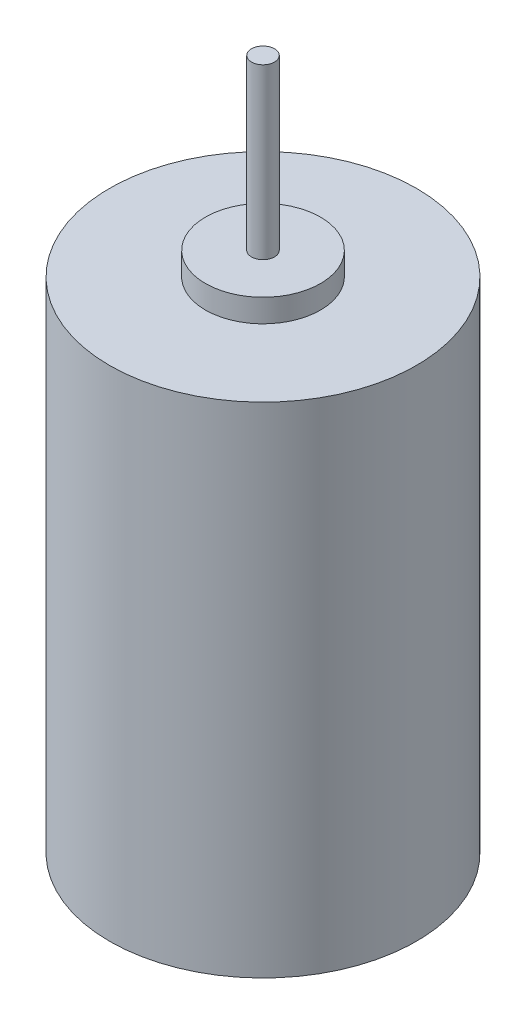
ISO-10303-21;
HEADER;
FILE_DESCRIPTION(('STEP AP214'),'2;1');
FILE_NAME('part.step','',(''),(''),'','','');
FILE_SCHEMA(('AUTOMOTIVE_DESIGN { 1 0 10303 214 1 1 1 1 }'));
ENDSEC;
DATA;
#1=APPLICATION_CONTEXT('core data for automotive mechanical design processes');
#2=APPLICATION_PROTOCOL_DEFINITION('international standard','automotive_design',2000,#1);
#3=PRODUCT_CONTEXT('',#1,'mechanical');
#4=PRODUCT('Part','Part','',(#3));
#5=PRODUCT_RELATED_PRODUCT_CATEGORY('part','',(#4));
#6=PRODUCT_DEFINITION_FORMATION('','',#4);
#7=PRODUCT_DEFINITION_CONTEXT('part definition',#1,'design');
#8=PRODUCT_DEFINITION('design','',#6,#7);
#9=PRODUCT_DEFINITION_SHAPE('','',#8);
#10=(LENGTH_UNIT() NAMED_UNIT(*) SI_UNIT(.MILLI.,.METRE.));
#11=(NAMED_UNIT(*) PLANE_ANGLE_UNIT() SI_UNIT($,.RADIAN.));
#12=(NAMED_UNIT(*) SI_UNIT($,.STERADIAN.) SOLID_ANGLE_UNIT());
#13=UNCERTAINTY_MEASURE_WITH_UNIT(LENGTH_MEASURE(1.E-05),#10,'distance_accuracy_value','');
#14=(GEOMETRIC_REPRESENTATION_CONTEXT(3) GLOBAL_UNCERTAINTY_ASSIGNED_CONTEXT((#13)) GLOBAL_UNIT_ASSIGNED_CONTEXT((#10,
#11,#12)) REPRESENTATION_CONTEXT('',''));
#15=CARTESIAN_POINT('',(0.,0.,0.));
#16=DIRECTION('',(0.,0.,1.));
#17=DIRECTION('',(1.,0.,0.));
#18=AXIS2_PLACEMENT_3D('',#15,#16,#17);
#19=CARTESIAN_POINT('',(0.,65.,0.));
#20=DIRECTION('',(0.,-1.,0.));
#21=DIRECTION('',(0.,0.,-1.));
#22=AXIS2_PLACEMENT_3D('',#19,#20,#21);
#23=CYLINDRICAL_SURFACE('',#22,20.);
#24=CARTESIAN_POINT('',(0.,65.,0.));
#25=DIRECTION('',(0.,1.,0.));
#26=DIRECTION('',(0.,0.,1.));
#27=AXIS2_PLACEMENT_3D('',#24,#25,#26);
#28=CIRCLE('',#27,20.);
#29=CARTESIAN_POINT('',(0.,65.,20.));
#30=VERTEX_POINT('',#29);
#31=EDGE_CURVE('E43',#30,#30,#28,.T.);
#32=ORIENTED_EDGE('',*,*,#31,.F.);
#33=EDGE_LOOP('',(#32));
#34=FACE_BOUND('',#33,.T.);
#35=CARTESIAN_POINT('',(0.,0.,0.));
#36=DIRECTION('',(0.,1.,0.));
#37=DIRECTION('',(0.,0.,1.));
#38=AXIS2_PLACEMENT_3D('',#35,#36,#37);
#39=CIRCLE('',#38,20.);
#40=CARTESIAN_POINT('',(0.,0.,20.));
#41=VERTEX_POINT('',#40);
#42=EDGE_CURVE('E48',#41,#41,#39,.T.);
#43=ORIENTED_EDGE('',*,*,#42,.T.);
#44=EDGE_LOOP('',(#43));
#45=FACE_BOUND('',#44,.T.);
#46=ADVANCED_FACE('F33',(#34,#45),#23,.T.);
#47=CARTESIAN_POINT('',(0.,65.,0.));
#48=DIRECTION('',(0.,1.,0.));
#49=DIRECTION('',(0.,0.,1.));
#50=AXIS2_PLACEMENT_3D('',#47,#48,#49);
#51=PLANE('',#50);
#52=CARTESIAN_POINT('',(0.,65.,0.));
#53=DIRECTION('',(0.,1.,0.));
#54=DIRECTION('',(0.,0.,1.));
#55=AXIS2_PLACEMENT_3D('',#52,#53,#54);
#56=CIRCLE('',#55,7.5);
#57=CARTESIAN_POINT('',(0.,65.,7.5));
#58=VERTEX_POINT('',#57);
#59=EDGE_CURVE('E39',#58,#58,#56,.T.);
#60=ORIENTED_EDGE('',*,*,#59,.F.);
#61=EDGE_LOOP('',(#60));
#62=FACE_BOUND('',#61,.T.);
#63=ORIENTED_EDGE('',*,*,#31,.T.);
#64=EDGE_LOOP('',(#63));
#65=FACE_BOUND('',#64,.T.);
#66=ADVANCED_FACE('F94',(#62,#65),#51,.T.);
#67=CARTESIAN_POINT('',(0.,0.,0.));
#68=DIRECTION('',(0.,1.,0.));
#69=DIRECTION('',(0.,0.,1.));
#70=AXIS2_PLACEMENT_3D('',#67,#68,#69);
#71=PLANE('',#70);
#72=CARTESIAN_POINT('',(0.,0.,0.));
#73=DIRECTION('',(0.,1.,0.));
#74=DIRECTION('',(0.,0.,1.));
#75=AXIS2_PLACEMENT_3D('',#72,#73,#74);
#76=CIRCLE('',#75,7.5);
#77=CARTESIAN_POINT('',(0.,0.,7.5));
#78=VERTEX_POINT('',#77);
#79=EDGE_CURVE('E55',#78,#78,#76,.T.);
#80=ORIENTED_EDGE('',*,*,#79,.T.);
#81=EDGE_LOOP('',(#80));
#82=FACE_BOUND('',#81,.T.);
#83=ORIENTED_EDGE('',*,*,#42,.F.);
#84=EDGE_LOOP('',(#83));
#85=FACE_BOUND('',#84,.T.);
#86=ADVANCED_FACE('F99',(#82,#85),#71,.F.);
#87=CARTESIAN_POINT('',(0.,-3.,0.));
#88=DIRECTION('',(0.,1.,0.));
#89=DIRECTION('',(0.,0.,1.));
#90=AXIS2_PLACEMENT_3D('',#87,#88,#89);
#91=PLANE('',#90);
#92=CARTESIAN_POINT('',(0.,-3.,0.));
#93=DIRECTION('',(0.,1.,0.));
#94=DIRECTION('',(0.,0.,1.));
#95=AXIS2_PLACEMENT_3D('',#92,#93,#94);
#96=CIRCLE('',#95,1.5);
#97=CARTESIAN_POINT('',(0.,-3.,1.5));
#98=VERTEX_POINT('',#97);
#99=EDGE_CURVE('E64',#98,#98,#96,.T.);
#100=ORIENTED_EDGE('',*,*,#99,.T.);
#101=EDGE_LOOP('',(#100));
#102=FACE_BOUND('',#101,.T.);
#103=CARTESIAN_POINT('',(0.,-3.,0.));
#104=DIRECTION('',(0.,1.,0.));
#105=DIRECTION('',(0.,0.,1.));
#106=AXIS2_PLACEMENT_3D('',#103,#104,#105);
#107=CIRCLE('',#106,7.5);
#108=CARTESIAN_POINT('',(0.,-3.,7.5));
#109=VERTEX_POINT('',#108);
#110=EDGE_CURVE('E51',#109,#109,#107,.T.);
#111=ORIENTED_EDGE('',*,*,#110,.F.);
#112=EDGE_LOOP('',(#111));
#113=FACE_BOUND('',#112,.T.);
#114=ADVANCED_FACE('F107',(#102,#113),#91,.F.);
#115=CARTESIAN_POINT('',(0.,-3.,0.));
#116=DIRECTION('',(0.,1.,0.));
#117=DIRECTION('',(0.,0.,1.));
#118=AXIS2_PLACEMENT_3D('',#115,#116,#117);
#119=CYLINDRICAL_SURFACE('',#118,7.5);
#120=ORIENTED_EDGE('',*,*,#110,.T.);
#121=EDGE_LOOP('',(#120));
#122=FACE_BOUND('',#121,.T.);
#123=ORIENTED_EDGE('',*,*,#79,.F.);
#124=EDGE_LOOP('',(#123));
#125=FACE_BOUND('',#124,.T.);
#126=ADVANCED_FACE('F111',(#122,#125),#119,.T.);
#127=ORIENTED_EDGE('',*,*,#59,.T.);
#128=EDGE_LOOP('',(#127));
#129=FACE_BOUND('',#128,.T.);
#130=CARTESIAN_POINT('',(0.,68.,0.));
#131=DIRECTION('',(0.,1.,0.));
#132=DIRECTION('',(0.,0.,1.));
#133=AXIS2_PLACEMENT_3D('',#130,#131,#132);
#134=CIRCLE('',#133,7.5);
#135=CARTESIAN_POINT('',(0.,68.,7.5));
#136=VERTEX_POINT('',#135);
#137=EDGE_CURVE('E60',#136,#136,#134,.T.);
#138=ORIENTED_EDGE('',*,*,#137,.F.);
#139=EDGE_LOOP('',(#138));
#140=FACE_BOUND('',#139,.T.);
#141=ADVANCED_FACE('F115',(#129,#140),#119,.T.);
#142=CARTESIAN_POINT('',(0.,68.,0.));
#143=DIRECTION('',(0.,1.,0.));
#144=DIRECTION('',(0.,0.,1.));
#145=AXIS2_PLACEMENT_3D('',#142,#143,#144);
#146=PLANE('',#145);
#147=CARTESIAN_POINT('',(0.,68.,0.));
#148=DIRECTION('',(0.,1.,0.));
#149=DIRECTION('',(0.,0.,1.));
#150=AXIS2_PLACEMENT_3D('',#147,#148,#149);
#151=CIRCLE('',#150,1.5);
#152=CARTESIAN_POINT('',(0.,68.,1.5));
#153=VERTEX_POINT('',#152);
#154=EDGE_CURVE('E10',#153,#153,#151,.T.);
#155=ORIENTED_EDGE('',*,*,#154,.F.);
#156=EDGE_LOOP('',(#155));
#157=FACE_BOUND('',#156,.T.);
#158=ORIENTED_EDGE('',*,*,#137,.T.);
#159=EDGE_LOOP('',(#158));
#160=FACE_BOUND('',#159,.T.);
#161=ADVANCED_FACE('F89',(#157,#160),#146,.T.);
#162=CARTESIAN_POINT('',(0.,90.,0.));
#163=DIRECTION('',(0.,1.,0.));
#164=DIRECTION('',(0.,0.,1.));
#165=AXIS2_PLACEMENT_3D('',#162,#163,#164);
#166=PLANE('',#165);
#167=CARTESIAN_POINT('',(0.,90.,0.));
#168=DIRECTION('',(0.,1.,0.));
#169=DIRECTION('',(0.,0.,1.));
#170=AXIS2_PLACEMENT_3D('',#167,#168,#169);
#171=CIRCLE('',#170,1.5);
#172=CARTESIAN_POINT('',(0.,90.,1.5));
#173=VERTEX_POINT('',#172);
#174=EDGE_CURVE('E73',#173,#173,#171,.T.);
#175=ORIENTED_EDGE('',*,*,#174,.T.);
#176=EDGE_LOOP('',(#175));
#177=FACE_BOUND('',#176,.T.);
#178=ADVANCED_FACE('F77',(#177),#166,.T.);
#179=CARTESIAN_POINT('',(0.,-10.,0.));
#180=DIRECTION('',(0.,1.,0.));
#181=DIRECTION('',(0.,0.,1.));
#182=AXIS2_PLACEMENT_3D('',#179,#180,#181);
#183=CYLINDRICAL_SURFACE('',#182,1.5);
#184=ORIENTED_EDGE('',*,*,#154,.T.);
#185=EDGE_LOOP('',(#184));
#186=FACE_BOUND('',#185,.T.);
#187=ORIENTED_EDGE('',*,*,#174,.F.);
#188=EDGE_LOOP('',(#187));
#189=FACE_BOUND('',#188,.T.);
#190=ADVANCED_FACE('F79',(#186,#189),#183,.T.);
#191=CARTESIAN_POINT('',(0.,-10.,0.));
#192=DIRECTION('',(0.,1.,0.));
#193=DIRECTION('',(0.,0.,1.));
#194=AXIS2_PLACEMENT_3D('',#191,#192,#193);
#195=CIRCLE('',#194,1.5);
#196=CARTESIAN_POINT('',(0.,-10.,1.5));
#197=VERTEX_POINT('',#196);
#198=EDGE_CURVE('E68',#197,#197,#195,.T.);
#199=ORIENTED_EDGE('',*,*,#198,.T.);
#200=EDGE_LOOP('',(#199));
#201=FACE_BOUND('',#200,.T.);
#202=ORIENTED_EDGE('',*,*,#99,.F.);
#203=EDGE_LOOP('',(#202));
#204=FACE_BOUND('',#203,.T.);
#205=ADVANCED_FACE('F81',(#201,#204),#183,.T.);
#206=CARTESIAN_POINT('',(0.,-10.,0.));
#207=DIRECTION('',(0.,1.,0.));
#208=DIRECTION('',(0.,0.,1.));
#209=AXIS2_PLACEMENT_3D('',#206,#207,#208);
#210=PLANE('',#209);
#211=ORIENTED_EDGE('',*,*,#198,.F.);
#212=EDGE_LOOP('',(#211));
#213=FACE_BOUND('',#212,.T.);
#214=ADVANCED_FACE('F87',(#213),#210,.F.);
#215=CLOSED_SHELL('',(#46,#66,#86,#114,#126,#141,#161,#178,#190,#205,#214));
#216=MANIFOLD_SOLID_BREP('B2',#215);
#217=ADVANCED_BREP_SHAPE_REPRESENTATION('',(#18,#216),#14);
#218=SHAPE_DEFINITION_REPRESENTATION(#9,#217);
ENDSEC;
END-ISO-10303-21;
